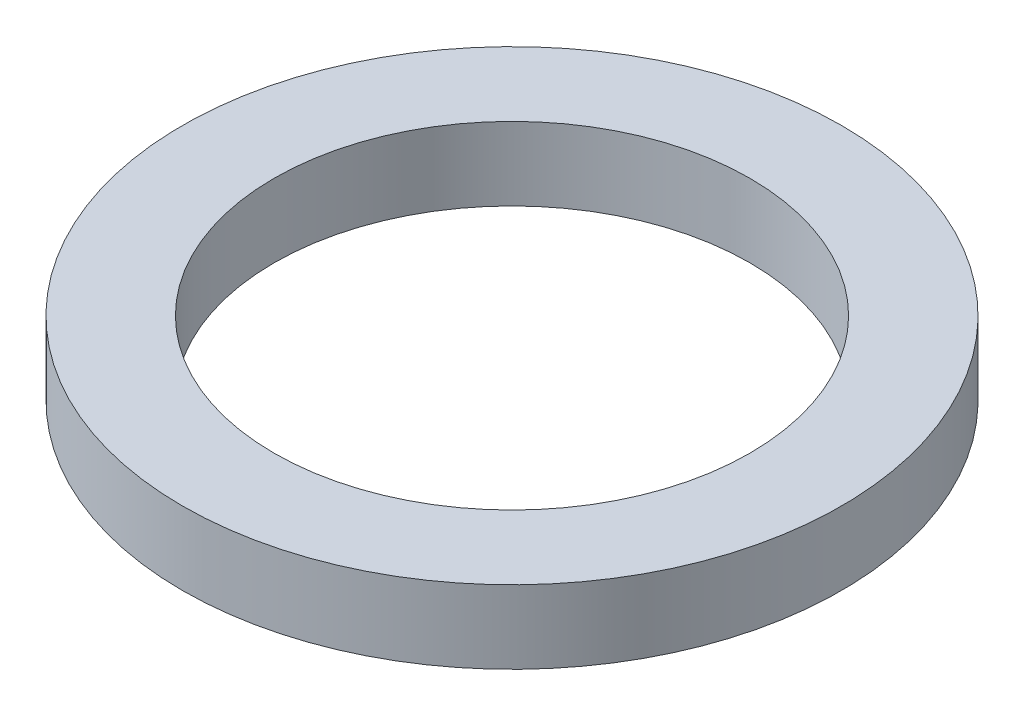
ISO-10303-21;
HEADER;
FILE_DESCRIPTION(('STEP AP214'),'2;1');
FILE_NAME('part.step','',(''),(''),'','','');
FILE_SCHEMA(('AUTOMOTIVE_DESIGN { 1 0 10303 214 1 1 1 1 }'));
ENDSEC;
DATA;
#1=APPLICATION_CONTEXT('core data for automotive mechanical design processes');
#2=APPLICATION_PROTOCOL_DEFINITION('international standard','automotive_design',2000,#1);
#3=PRODUCT_CONTEXT('',#1,'mechanical');
#4=PRODUCT('Part','Part','',(#3));
#5=PRODUCT_RELATED_PRODUCT_CATEGORY('part','',(#4));
#6=PRODUCT_DEFINITION_FORMATION('','',#4);
#7=PRODUCT_DEFINITION_CONTEXT('part definition',#1,'design');
#8=PRODUCT_DEFINITION('design','',#6,#7);
#9=PRODUCT_DEFINITION_SHAPE('','',#8);
#10=(LENGTH_UNIT() NAMED_UNIT(*) SI_UNIT(.MILLI.,.METRE.));
#11=(NAMED_UNIT(*) PLANE_ANGLE_UNIT() SI_UNIT($,.RADIAN.));
#12=(NAMED_UNIT(*) SI_UNIT($,.STERADIAN.) SOLID_ANGLE_UNIT());
#13=UNCERTAINTY_MEASURE_WITH_UNIT(LENGTH_MEASURE(1.E-05),#10,'distance_accuracy_value','');
#14=(GEOMETRIC_REPRESENTATION_CONTEXT(3) GLOBAL_UNCERTAINTY_ASSIGNED_CONTEXT((#13)) GLOBAL_UNIT_ASSIGNED_CONTEXT((#10,
#11,#12)) REPRESENTATION_CONTEXT('',''));
#15=CARTESIAN_POINT('',(0.,0.,0.));
#16=DIRECTION('',(0.,0.,1.));
#17=DIRECTION('',(1.,0.,0.));
#18=AXIS2_PLACEMENT_3D('',#15,#16,#17);
#19=CARTESIAN_POINT('',(0.,1.,0.));
#20=DIRECTION('',(0.,1.,0.));
#21=DIRECTION('',(0.,0.,1.));
#22=AXIS2_PLACEMENT_3D('',#19,#20,#21);
#23=PLANE('',#22);
#24=CARTESIAN_POINT('',(0.,1.,0.));
#25=DIRECTION('',(0.,1.,0.));
#26=DIRECTION('',(0.,0.,1.));
#27=AXIS2_PLACEMENT_3D('',#24,#25,#26);
#28=CIRCLE('',#27,4.5);
#29=CARTESIAN_POINT('',(0.,1.,4.5));
#30=VERTEX_POINT('',#29);
#31=EDGE_CURVE('E10',#30,#30,#28,.T.);
#32=ORIENTED_EDGE('',*,*,#31,.T.);
#33=EDGE_LOOP('',(#32));
#34=FACE_BOUND('',#33,.T.);
#35=CARTESIAN_POINT('',(0.,1.,0.));
#36=DIRECTION('',(0.,1.,0.));
#37=DIRECTION('',(0.,0.,1.));
#38=AXIS2_PLACEMENT_3D('',#35,#36,#37);
#39=CIRCLE('',#38,3.25);
#40=CARTESIAN_POINT('',(0.,1.,3.25));
#41=VERTEX_POINT('',#40);
#42=EDGE_CURVE('E43',#41,#41,#39,.T.);
#43=ORIENTED_EDGE('',*,*,#42,.F.);
#44=EDGE_LOOP('',(#43));
#45=FACE_BOUND('',#44,.T.);
#46=ADVANCED_FACE('F32',(#34,#45),#23,.T.);
#47=CARTESIAN_POINT('',(0.,0.,0.));
#48=DIRECTION('',(0.,1.,0.));
#49=DIRECTION('',(0.,0.,1.));
#50=AXIS2_PLACEMENT_3D('',#47,#48,#49);
#51=PLANE('',#50);
#52=CARTESIAN_POINT('',(0.,0.,0.));
#53=DIRECTION('',(0.,1.,0.));
#54=DIRECTION('',(0.,0.,1.));
#55=AXIS2_PLACEMENT_3D('',#52,#53,#54);
#56=CIRCLE('',#55,4.5);
#57=CARTESIAN_POINT('',(0.,0.,4.5));
#58=VERTEX_POINT('',#57);
#59=EDGE_CURVE('E36',#58,#58,#56,.T.);
#60=ORIENTED_EDGE('',*,*,#59,.F.);
#61=EDGE_LOOP('',(#60));
#62=FACE_BOUND('',#61,.T.);
#63=CARTESIAN_POINT('',(0.,0.,0.));
#64=DIRECTION('',(0.,1.,0.));
#65=DIRECTION('',(0.,0.,1.));
#66=AXIS2_PLACEMENT_3D('',#63,#64,#65);
#67=CIRCLE('',#66,3.25);
#68=CARTESIAN_POINT('',(0.,0.,3.25));
#69=VERTEX_POINT('',#68);
#70=EDGE_CURVE('E45',#69,#69,#67,.T.);
#71=ORIENTED_EDGE('',*,*,#70,.T.);
#72=EDGE_LOOP('',(#71));
#73=FACE_BOUND('',#72,.T.);
#74=ADVANCED_FACE('F55',(#62,#73),#51,.F.);
#75=CARTESIAN_POINT('',(0.,1.,0.));
#76=DIRECTION('',(0.,-1.,0.));
#77=DIRECTION('',(0.,0.,-1.));
#78=AXIS2_PLACEMENT_3D('',#75,#76,#77);
#79=CYLINDRICAL_SURFACE('',#78,4.5);
#80=ORIENTED_EDGE('',*,*,#31,.F.);
#81=EDGE_LOOP('',(#80));
#82=FACE_BOUND('',#81,.T.);
#83=ORIENTED_EDGE('',*,*,#59,.T.);
#84=EDGE_LOOP('',(#83));
#85=FACE_BOUND('',#84,.T.);
#86=ADVANCED_FACE('F34',(#82,#85),#79,.T.);
#87=CARTESIAN_POINT('',(0.,1.,0.));
#88=DIRECTION('',(0.,-1.,0.));
#89=DIRECTION('',(0.,0.,-1.));
#90=AXIS2_PLACEMENT_3D('',#87,#88,#89);
#91=CYLINDRICAL_SURFACE('',#90,3.25);
#92=ORIENTED_EDGE('',*,*,#42,.T.);
#93=EDGE_LOOP('',(#92));
#94=FACE_BOUND('',#93,.T.);
#95=ORIENTED_EDGE('',*,*,#70,.F.);
#96=EDGE_LOOP('',(#95));
#97=FACE_BOUND('',#96,.T.);
#98=ADVANCED_FACE('F51',(#94,#97),#91,.F.);
#99=CLOSED_SHELL('',(#46,#74,#86,#98));
#100=MANIFOLD_SOLID_BREP('B2',#99);
#101=ADVANCED_BREP_SHAPE_REPRESENTATION('',(#18,#100),#14);
#102=SHAPE_DEFINITION_REPRESENTATION(#9,#101);
ENDSEC;
END-ISO-10303-21;
